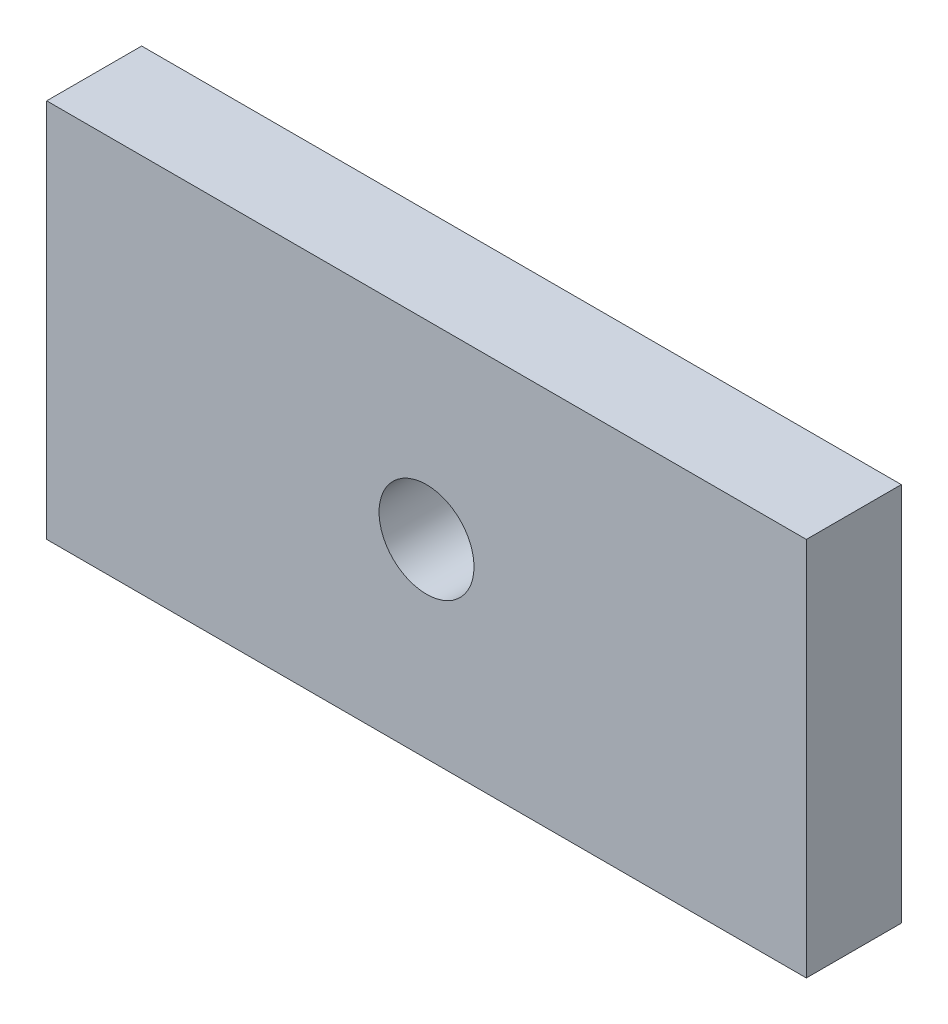
ISO-10303-21;
HEADER;
FILE_DESCRIPTION(('STEP AP214'),'2;1');
FILE_NAME('part.step','',(''),(''),'','','');
FILE_SCHEMA(('AUTOMOTIVE_DESIGN { 1 0 10303 214 1 1 1 1 }'));
ENDSEC;
DATA;
#1=APPLICATION_CONTEXT('core data for automotive mechanical design processes');
#2=APPLICATION_PROTOCOL_DEFINITION('international standard','automotive_design',2000,#1);
#3=PRODUCT_CONTEXT('',#1,'mechanical');
#4=PRODUCT('Part','Part','',(#3));
#5=PRODUCT_RELATED_PRODUCT_CATEGORY('part','',(#4));
#6=PRODUCT_DEFINITION_FORMATION('','',#4);
#7=PRODUCT_DEFINITION_CONTEXT('part definition',#1,'design');
#8=PRODUCT_DEFINITION('design','',#6,#7);
#9=PRODUCT_DEFINITION_SHAPE('','',#8);
#10=(LENGTH_UNIT() NAMED_UNIT(*) SI_UNIT(.MILLI.,.METRE.));
#11=(NAMED_UNIT(*) PLANE_ANGLE_UNIT() SI_UNIT($,.RADIAN.));
#12=(NAMED_UNIT(*) SI_UNIT($,.STERADIAN.) SOLID_ANGLE_UNIT());
#13=UNCERTAINTY_MEASURE_WITH_UNIT(LENGTH_MEASURE(1.E-05),#10,'distance_accuracy_value','');
#14=(GEOMETRIC_REPRESENTATION_CONTEXT(3) GLOBAL_UNCERTAINTY_ASSIGNED_CONTEXT((#13)) GLOBAL_UNIT_ASSIGNED_CONTEXT((#10,
#11,#12)) REPRESENTATION_CONTEXT('',''));
#15=CARTESIAN_POINT('',(0.,0.,0.));
#16=DIRECTION('',(0.,0.,1.));
#17=DIRECTION('',(1.,0.,0.));
#18=AXIS2_PLACEMENT_3D('',#15,#16,#17);
#19=CARTESIAN_POINT('',(0.,0.,10.));
#20=DIRECTION('',(0.,0.,-1.));
#21=DIRECTION('',(-1.,0.,0.));
#22=AXIS2_PLACEMENT_3D('',#19,#20,#21);
#23=PLANE('',#22);
#24=DIRECTION('',(0.,1.,0.));
#25=VECTOR('',#24,1.);
#26=CARTESIAN_POINT('',(40.,-20.,10.));
#27=LINE('',#26,#25);
#28=CARTESIAN_POINT('',(40.,-20.,10.));
#29=VERTEX_POINT('',#28);
#30=CARTESIAN_POINT('',(40.,20.,10.));
#31=VERTEX_POINT('',#30);
#32=EDGE_CURVE('E94',#29,#31,#27,.T.);
#33=ORIENTED_EDGE('',*,*,#32,.T.);
#34=DIRECTION('',(-1.,0.,0.));
#35=VECTOR('',#34,1.);
#36=CARTESIAN_POINT('',(-40.,20.,10.));
#37=LINE('',#36,#35);
#38=CARTESIAN_POINT('',(-40.,20.,10.));
#39=VERTEX_POINT('',#38);
#40=EDGE_CURVE('E89',#31,#39,#37,.T.);
#41=ORIENTED_EDGE('',*,*,#40,.T.);
#42=DIRECTION('',(0.,-1.,0.));
#43=VECTOR('',#42,1.);
#44=CARTESIAN_POINT('',(-40.,-20.,10.));
#45=LINE('',#44,#43);
#46=CARTESIAN_POINT('',(-40.,-20.,10.));
#47=VERTEX_POINT('',#46);
#48=EDGE_CURVE('E92',#39,#47,#45,.T.);
#49=ORIENTED_EDGE('',*,*,#48,.T.);
#50=DIRECTION('',(1.,0.,0.));
#51=VECTOR('',#50,1.);
#52=CARTESIAN_POINT('',(-40.,-20.,10.));
#53=LINE('',#52,#51);
#54=EDGE_CURVE('E59',#47,#29,#53,.T.);
#55=ORIENTED_EDGE('',*,*,#54,.T.);
#56=EDGE_LOOP('',(#33,#41,#49,#55));
#57=FACE_BOUND('',#56,.T.);
#58=CARTESIAN_POINT('',(0.,0.,10.));
#59=DIRECTION('',(0.,0.,1.));
#60=DIRECTION('',(1.,0.,0.));
#61=AXIS2_PLACEMENT_3D('',#58,#59,#60);
#62=CIRCLE('',#61,5.);
#63=CARTESIAN_POINT('',(5.00000000000001,0.,10.));
#64=VERTEX_POINT('',#63);
#65=EDGE_CURVE('E114',#64,#64,#62,.T.);
#66=ORIENTED_EDGE('',*,*,#65,.F.);
#67=EDGE_LOOP('',(#66));
#68=FACE_BOUND('',#67,.T.);
#69=ADVANCED_FACE('F41',(#57,#68),#23,.F.);
#70=CARTESIAN_POINT('',(0.,0.,0.));
#71=DIRECTION('',(0.,0.,-1.));
#72=DIRECTION('',(-1.,0.,0.));
#73=AXIS2_PLACEMENT_3D('',#70,#71,#72);
#74=PLANE('',#73);
#75=DIRECTION('',(0.,1.,0.));
#76=VECTOR('',#75,1.);
#77=CARTESIAN_POINT('',(40.,-20.,0.));
#78=LINE('',#77,#76);
#79=CARTESIAN_POINT('',(40.,-20.,0.));
#80=VERTEX_POINT('',#79);
#81=CARTESIAN_POINT('',(40.,20.,0.));
#82=VERTEX_POINT('',#81);
#83=EDGE_CURVE('E110',#80,#82,#78,.T.);
#84=ORIENTED_EDGE('',*,*,#83,.F.);
#85=DIRECTION('',(1.,0.,0.));
#86=VECTOR('',#85,1.);
#87=CARTESIAN_POINT('',(-40.,-20.,0.));
#88=LINE('',#87,#86);
#89=CARTESIAN_POINT('',(-40.,-20.,0.));
#90=VERTEX_POINT('',#89);
#91=EDGE_CURVE('E82',#90,#80,#88,.T.);
#92=ORIENTED_EDGE('',*,*,#91,.F.);
#93=DIRECTION('',(0.,-1.,0.));
#94=VECTOR('',#93,1.);
#95=CARTESIAN_POINT('',(-40.,-20.,0.));
#96=LINE('',#95,#94);
#97=CARTESIAN_POINT('',(-40.,20.,0.));
#98=VERTEX_POINT('',#97);
#99=EDGE_CURVE('E76',#98,#90,#96,.T.);
#100=ORIENTED_EDGE('',*,*,#99,.F.);
#101=DIRECTION('',(-1.,0.,0.));
#102=VECTOR('',#101,1.);
#103=CARTESIAN_POINT('',(-40.,20.,0.));
#104=LINE('',#103,#102);
#105=EDGE_CURVE('E99',#82,#98,#104,.T.);
#106=ORIENTED_EDGE('',*,*,#105,.F.);
#107=EDGE_LOOP('',(#84,#92,#100,#106));
#108=FACE_BOUND('',#107,.T.);
#109=CARTESIAN_POINT('',(0.,0.,0.));
#110=DIRECTION('',(0.,0.,1.));
#111=DIRECTION('',(1.,0.,0.));
#112=AXIS2_PLACEMENT_3D('',#109,#110,#111);
#113=CIRCLE('',#112,5.);
#114=CARTESIAN_POINT('',(5.00000000000001,0.,0.));
#115=VERTEX_POINT('',#114);
#116=EDGE_CURVE('E132',#115,#115,#113,.T.);
#117=ORIENTED_EDGE('',*,*,#116,.T.);
#118=EDGE_LOOP('',(#117));
#119=FACE_BOUND('',#118,.T.);
#120=ADVANCED_FACE('F127',(#108,#119),#74,.T.);
#121=CARTESIAN_POINT('',(40.,-20.,10.));
#122=DIRECTION('',(-1.,0.,0.));
#123=DIRECTION('',(0.,0.,1.));
#124=AXIS2_PLACEMENT_3D('',#121,#122,#123);
#125=PLANE('',#124);
#126=ORIENTED_EDGE('',*,*,#83,.T.);
#127=DIRECTION('',(0.,0.,-1.));
#128=VECTOR('',#127,1.);
#129=CARTESIAN_POINT('',(40.,20.,10.));
#130=LINE('',#129,#128);
#131=EDGE_CURVE('E11',#31,#82,#130,.T.);
#132=ORIENTED_EDGE('',*,*,#131,.F.);
#133=ORIENTED_EDGE('',*,*,#32,.F.);
#134=DIRECTION('',(0.,0.,-1.));
#135=VECTOR('',#134,1.);
#136=CARTESIAN_POINT('',(40.,-20.,10.));
#137=LINE('',#136,#135);
#138=EDGE_CURVE('E106',#29,#80,#137,.T.);
#139=ORIENTED_EDGE('',*,*,#138,.T.);
#140=EDGE_LOOP('',(#126,#132,#133,#139));
#141=FACE_BOUND('',#140,.T.);
#142=ADVANCED_FACE('F43',(#141),#125,.F.);
#143=CARTESIAN_POINT('',(-40.,20.,10.));
#144=DIRECTION('',(0.,-1.,0.));
#145=DIRECTION('',(0.,0.,-1.));
#146=AXIS2_PLACEMENT_3D('',#143,#144,#145);
#147=PLANE('',#146);
#148=ORIENTED_EDGE('',*,*,#105,.T.);
#149=DIRECTION('',(0.,0.,-1.));
#150=VECTOR('',#149,1.);
#151=CARTESIAN_POINT('',(-40.,20.,10.));
#152=LINE('',#151,#150);
#153=EDGE_CURVE('E51',#39,#98,#152,.T.);
#154=ORIENTED_EDGE('',*,*,#153,.F.);
#155=ORIENTED_EDGE('',*,*,#40,.F.);
#156=ORIENTED_EDGE('',*,*,#131,.T.);
#157=EDGE_LOOP('',(#148,#154,#155,#156));
#158=FACE_BOUND('',#157,.T.);
#159=ADVANCED_FACE('F98',(#158),#147,.F.);
#160=CARTESIAN_POINT('',(-40.,-20.,10.));
#161=DIRECTION('',(1.,0.,0.));
#162=DIRECTION('',(0.,0.,-1.));
#163=AXIS2_PLACEMENT_3D('',#160,#161,#162);
#164=PLANE('',#163);
#165=ORIENTED_EDGE('',*,*,#99,.T.);
#166=DIRECTION('',(0.,0.,-1.));
#167=VECTOR('',#166,1.);
#168=CARTESIAN_POINT('',(-40.,-20.,10.));
#169=LINE('',#168,#167);
#170=EDGE_CURVE('E101',#47,#90,#169,.T.);
#171=ORIENTED_EDGE('',*,*,#170,.F.);
#172=ORIENTED_EDGE('',*,*,#48,.F.);
#173=ORIENTED_EDGE('',*,*,#153,.T.);
#174=EDGE_LOOP('',(#165,#171,#172,#173));
#175=FACE_BOUND('',#174,.T.);
#176=ADVANCED_FACE('F102',(#175),#164,.F.);
#177=CARTESIAN_POINT('',(-40.,-20.,10.));
#178=DIRECTION('',(0.,1.,0.));
#179=DIRECTION('',(0.,0.,1.));
#180=AXIS2_PLACEMENT_3D('',#177,#178,#179);
#181=PLANE('',#180);
#182=ORIENTED_EDGE('',*,*,#91,.T.);
#183=ORIENTED_EDGE('',*,*,#138,.F.);
#184=ORIENTED_EDGE('',*,*,#54,.F.);
#185=ORIENTED_EDGE('',*,*,#170,.T.);
#186=EDGE_LOOP('',(#182,#183,#184,#185));
#187=FACE_BOUND('',#186,.T.);
#188=ADVANCED_FACE('F124',(#187),#181,.F.);
#189=CARTESIAN_POINT('',(0.,0.,10.));
#190=DIRECTION('',(0.,0.,-1.));
#191=DIRECTION('',(-1.,0.,0.));
#192=AXIS2_PLACEMENT_3D('',#189,#190,#191);
#193=CYLINDRICAL_SURFACE('',#192,5.);
#194=ORIENTED_EDGE('',*,*,#65,.T.);
#195=EDGE_LOOP('',(#194));
#196=FACE_BOUND('',#195,.T.);
#197=ORIENTED_EDGE('',*,*,#116,.F.);
#198=EDGE_LOOP('',(#197));
#199=FACE_BOUND('',#198,.T.);
#200=ADVANCED_FACE('F140',(#196,#199),#193,.F.);
#201=CLOSED_SHELL('',(#69,#120,#142,#159,#176,#188,#200));
#202=MANIFOLD_SOLID_BREP('B2',#201);
#203=ADVANCED_BREP_SHAPE_REPRESENTATION('',(#18,#202),#14);
#204=SHAPE_DEFINITION_REPRESENTATION(#9,#203);
ENDSEC;
END-ISO-10303-21;
